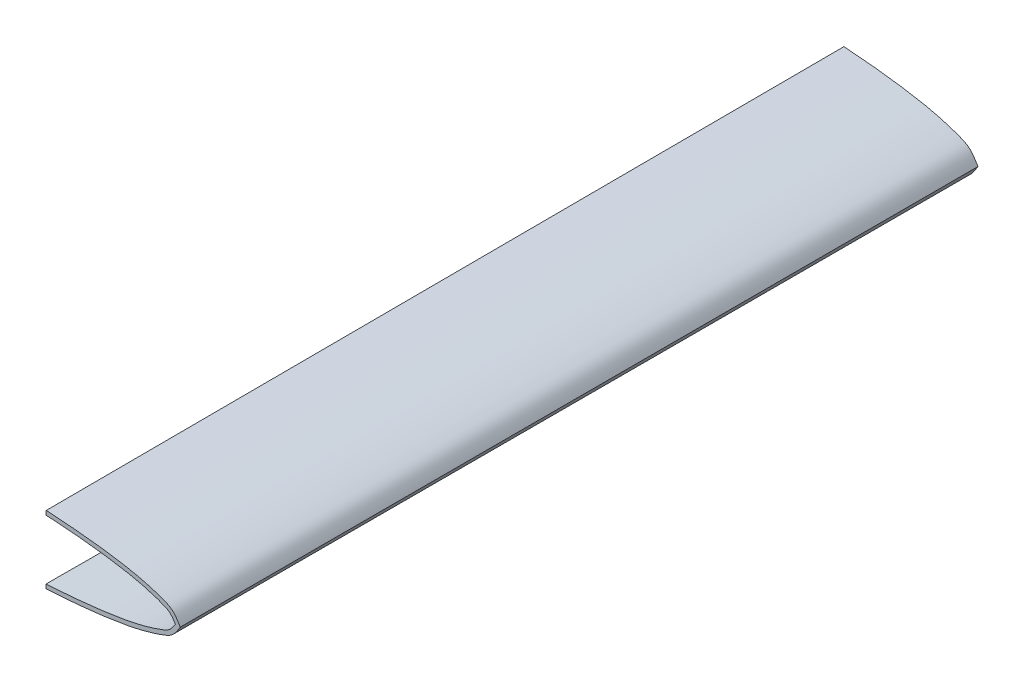
ISO-10303-21;
HEADER;
FILE_DESCRIPTION(('STEP AP214'),'2;1');
FILE_NAME('part.step','',(''),(''),'','','');
FILE_SCHEMA(('AUTOMOTIVE_DESIGN { 1 0 10303 214 1 1 1 1 }'));
ENDSEC;
DATA;
#1=APPLICATION_CONTEXT('core data for automotive mechanical design processes');
#2=APPLICATION_PROTOCOL_DEFINITION('international standard','automotive_design',2000,#1);
#3=PRODUCT_CONTEXT('',#1,'mechanical');
#4=PRODUCT('Part','Part','',(#3));
#5=PRODUCT_RELATED_PRODUCT_CATEGORY('part','',(#4));
#6=PRODUCT_DEFINITION_FORMATION('','',#4);
#7=PRODUCT_DEFINITION_CONTEXT('part definition',#1,'design');
#8=PRODUCT_DEFINITION('design','',#6,#7);
#9=PRODUCT_DEFINITION_SHAPE('','',#8);
#10=(LENGTH_UNIT() NAMED_UNIT(*) SI_UNIT(.MILLI.,.METRE.));
#11=(NAMED_UNIT(*) PLANE_ANGLE_UNIT() SI_UNIT($,.RADIAN.));
#12=(NAMED_UNIT(*) SI_UNIT($,.STERADIAN.) SOLID_ANGLE_UNIT());
#13=UNCERTAINTY_MEASURE_WITH_UNIT(LENGTH_MEASURE(1.E-05),#10,'distance_accuracy_value','');
#14=(GEOMETRIC_REPRESENTATION_CONTEXT(3) GLOBAL_UNCERTAINTY_ASSIGNED_CONTEXT((#13)) GLOBAL_UNIT_ASSIGNED_CONTEXT((#10,
#11,#12)) REPRESENTATION_CONTEXT('',''));
#15=CARTESIAN_POINT('',(0.,0.,0.));
#16=DIRECTION('',(0.,0.,1.));
#17=DIRECTION('',(1.,0.,0.));
#18=AXIS2_PLACEMENT_3D('',#15,#16,#17);
#19=CARTESIAN_POINT('',(100.769536267763,11.2606933813704,0.));
#20=DIRECTION('',(0.,0.,1.));
#21=DIRECTION('',(1.,0.,0.));
#22=AXIS2_PLACEMENT_3D('',#19,#20,#21);
#23=PLANE('',#22);
#24=CARTESIAN_POINT('',(75.1528156983858,13.7911850152499,0.));
#25=CARTESIAN_POINT('',(80.7851976616999,13.4672984762672,0.));
#26=CARTESIAN_POINT('',(89.6831000826608,12.780242775752,0.));
#27=CARTESIAN_POINT('',(100.19271352468,11.404332376345,0.));
#28=CARTESIAN_POINT('',(105.261986090452,10.5172214013167,0.));
#29=CARTESIAN_POINT('',(108.160349839012,9.94511209347713,0.));
#30=CARTESIAN_POINT('',(111.223864860041,9.29223477938955,0.));
#31=CARTESIAN_POINT('',(114.053942210508,8.49975371526067,0.));
#32=CARTESIAN_POINT('',(116.852382556985,7.59994673736133,0.));
#33=CARTESIAN_POINT('',(117.997565335274,7.21208080340003,0.));
#34=CARTESIAN_POINT('',(119.567638962217,6.62104689252843,0.));
#35=CARTESIAN_POINT('',(120.115223225885,6.40312349562739,0.));
#36=CARTESIAN_POINT('',(120.732213482138,6.1060537628292,0.));
#37=CARTESIAN_POINT('',(121.329957812074,5.78999102727578,0.));
#38=CARTESIAN_POINT('',(121.981529534301,5.31472994907229,0.));
#39=CARTESIAN_POINT('',(122.396077353504,4.9038056982637,0.));
#40=CARTESIAN_POINT('',(123.141325826217,4.11307873778657,0.));
#41=CARTESIAN_POINT('',(123.675270720084,3.30592812748182,0.));
#42=CARTESIAN_POINT('',(124.183013326308,2.48914366379694,0.));
#43=B_SPLINE_CURVE_WITH_KNOTS('',3,(#24,#25,#26,#27,#28,#29,#30,#31,#32,#33,#34,#35,#36,#37,#38,
#39,#40,#41,#42),.UNSPECIFIED.,.F.,.F.,(4,1,1,1,1,1,2,1,1,2,1,1,2,4),(0.,0.328632032767279,
0.519638641274434,0.617228047043696,0.628398988541279,0.691721568683053,0.799639628448459,
0.862947686180054,0.869998506981676,0.897219728739026,0.909961393733808,0.936717858711111,
0.943979047121781,1.),.UNSPECIFIED.);
#44=CARTESIAN_POINT('',(75.1528156983858,13.7911850152499,0.));
#45=VERTEX_POINT('',#44);
#46=CARTESIAN_POINT('',(124.183013326308,2.48914366379694,0.));
#47=VERTEX_POINT('',#46);
#48=EDGE_CURVE('E180',#45,#47,#43,.T.);
#49=ORIENTED_EDGE('',*,*,#48,.T.);
#50=CARTESIAN_POINT('',(124.183013326307,2.48914366380107,0.));
#51=CARTESIAN_POINT('',(123.762664602562,1.8129461097584,0.));
#52=CARTESIAN_POINT('',(123.183236107431,0.925651889228741,0.));
#53=CARTESIAN_POINT('',(122.20239770747,-0.134547293020064,0.));
#54=CARTESIAN_POINT('',(121.702491637412,-0.544366629772625,0.));
#55=CARTESIAN_POINT('',(121.144648740487,-0.902665023246407,0.));
#56=CARTESIAN_POINT('',(120.903562377172,-1.03863792482672,0.));
#57=CARTESIAN_POINT('',(120.086761633239,-1.44926248073076,0.));
#58=CARTESIAN_POINT('',(119.025617070715,-1.86175499994897,0.));
#59=CARTESIAN_POINT('',(117.401464731146,-2.43646341380278,0.));
#60=CARTESIAN_POINT('',(116.147628049391,-2.85616855876543,0.));
#61=CARTESIAN_POINT('',(113.273800058442,-3.76445255926568,0.));
#62=CARTESIAN_POINT('',(110.917927202203,-4.37422649396611,0.));
#63=CARTESIAN_POINT('',(108.303559495534,-4.93371503153042,0.));
#64=CARTESIAN_POINT('',(106.191863020433,-5.37135581455527,0.));
#65=CARTESIAN_POINT('',(102.9985062685,-5.94160858651463,0.));
#66=CARTESIAN_POINT('',(92.3104019337967,-7.58196898348306,0.));
#67=CARTESIAN_POINT('',(83.1925348058126,-8.35057877411217,0.));
#68=CARTESIAN_POINT('',(75.1528156964637,-8.81289768775202,0.));
#69=B_SPLINE_CURVE_WITH_KNOTS('',3,(#50,#51,#52,#53,#54,#55,#56,#57,#58,#59,#60,#61,#62,#63,#64,
#65,#66,#67,#68),.UNSPECIFIED.,.F.,.F.,(4,1,1,2,2,1,1,1,1,2,1,1,1,4),(0.,0.0463783338430015,
0.0614955759350706,0.0839865210975653,0.100157116178865,0.137375522409702,0.166388470634605,
0.200360026958327,0.214383355192011,0.341970581301063,0.370129953948071,0.467600424740325,
0.530904509390897,1.),.UNSPECIFIED.);
#70=CARTESIAN_POINT('',(75.1528156964637,-8.81289768775202,0.));
#71=VERTEX_POINT('',#70);
#72=EDGE_CURVE('E408',#47,#71,#69,.T.);
#73=ORIENTED_EDGE('',*,*,#72,.T.);
#74=DIRECTION('',(0.0574095202806261,-0.998350713417459,0.));
#75=VECTOR('',#74,1.);
#76=CARTESIAN_POINT('',(75.1528156964637,-8.81289768775202,0.));
#77=LINE('',#76,#75);
#78=CARTESIAN_POINT('',(75.2439533099092,-10.3977794453022,0.));
#79=VERTEX_POINT('',#78);
#80=EDGE_CURVE('E176',#71,#79,#77,.T.);
#81=ORIENTED_EDGE('',*,*,#80,.T.);
#82=CARTESIAN_POINT('',(75.2439533099092,-10.3977794453022,0.));
#83=CARTESIAN_POINT('',(79.6314739347866,-10.1454778734094,0.));
#84=CARTESIAN_POINT('',(86.2028643261661,-9.67226104029933,0.));
#85=CARTESIAN_POINT('',(94.9576944072849,-8.71902149074964,0.));
#86=CARTESIAN_POINT('',(100.412903888817,-7.96440929858423,0.));
#87=CARTESIAN_POINT('',(104.77112861132,-7.24282371970884,0.));
#88=CARTESIAN_POINT('',(108.031142816358,-6.62660170255856,0.));
#89=CARTESIAN_POINT('',(111.298552698541,-5.90965043605575,0.));
#90=CARTESIAN_POINT('',(113.998018017873,-5.18510607575265,0.));
#91=CARTESIAN_POINT('',(116.137848035604,-4.53037048440972,0.));
#92=CARTESIAN_POINT('',(117.727025687003,-4.0036391458447,0.));
#93=CARTESIAN_POINT('',(119.296822126561,-3.45060274071213,0.));
#94=CARTESIAN_POINT('',(120.646602005858,-2.94373425804329,0.));
#95=CARTESIAN_POINT('',(121.65560610611,-2.44186688112708,0.));
#96=CARTESIAN_POINT('',(122.211426609884,-2.11112173589993,0.));
#97=CARTESIAN_POINT('',(122.810602623774,-1.69712336719391,0.));
#98=CARTESIAN_POINT('',(123.447004056008,-1.13454364440382,0.));
#99=CARTESIAN_POINT('',(124.323991705955,-0.168137732178443,0.));
#100=CARTESIAN_POINT('',(125.021946505972,0.833969142449591,0.));
#101=CARTESIAN_POINT('',(125.623250298365,1.79859475272735,0.));
#102=CARTESIAN_POINT('',(125.907913756833,2.25696552530411,0.));
#103=CARTESIAN_POINT('',(126.052244040783,2.48914366566276,0.));
#104=B_SPLINE_CURVE_WITH_KNOTS('',3,(#82,#83,#84,#85,#86,#87,#88,#89,#90,#91,#92,#93,#94,#95,
#96,#97,#98,#99,#100,#101,#102,#103),.UNSPECIFIED.,.F.,.F.,(4,1,1,1,1,1,1,1,1,1,1,1,1,1,1,1,1,1,
1,4),(-0.0191611243996706,0.235629156700247,0.363024297250206,0.490419437800165,
0.554117008075144,0.617814578350124,0.681512148625103,0.745209718900082,0.777058504037572,
0.808907289175062,0.840756074312552,0.872604859450041,0.888529252018786,0.896491448303159,
0.904453644587531,0.920378037156276,0.936302429725021,0.96815121486251,0.984075607431255,1.),.UNSPECIFIED.);
#105=CARTESIAN_POINT('',(126.052244040783,2.48914366566275,0.));
#106=VERTEX_POINT('',#105);
#107=EDGE_CURVE('E374',#79,#106,#104,.T.);
#108=ORIENTED_EDGE('',*,*,#107,.T.);
#109=CARTESIAN_POINT('',(126.052244040783,2.48914366566275,0.));
#110=CARTESIAN_POINT('',(125.907914237619,2.7213210315682,0.));
#111=CARTESIAN_POINT('',(125.623329343008,3.17954124131456,0.));
#112=CARTESIAN_POINT('',(125.172003730789,3.90367868832122,0.));
#113=CARTESIAN_POINT('',(124.672362727551,4.64494280584374,0.));
#114=CARTESIAN_POINT('',(124.200683403558,5.2644072300795,0.));
#115=CARTESIAN_POINT('',(123.790132337263,5.74139578204919,0.));
#116=CARTESIAN_POINT('',(123.318223384305,6.23987483520747,0.));
#117=CARTESIAN_POINT('',(122.387769604836,7.02893356893599,0.));
#118=CARTESIAN_POINT('',(120.901809068775,7.82814225529177,0.));
#119=CARTESIAN_POINT('',(119.303820139159,8.41873514571322,0.));
#120=CARTESIAN_POINT('',(117.71984148179,8.98372016832412,0.));
#121=CARTESIAN_POINT('',(116.135475936236,9.50325785185327,0.));
#122=CARTESIAN_POINT('',(113.99722073468,10.1604169112802,0.));
#123=CARTESIAN_POINT('',(111.299067207461,10.8875342299337,0.));
#124=CARTESIAN_POINT('',(108.029470566984,11.6029026049814,0.));
#125=CARTESIAN_POINT('',(104.772495006038,12.2190261548502,0.));
#126=CARTESIAN_POINT('',(100.414534164485,12.9450182760341,0.));
#127=CARTESIAN_POINT('',(94.955134539592,13.6971303660071,0.));
#128=CARTESIAN_POINT('',(86.2021086206738,14.6449581358404,0.));
#129=CARTESIAN_POINT('',(79.6311175435253,15.1237856867148,0.));
#130=CARTESIAN_POINT('',(75.2439533148395,15.3760667726272,0.));
#131=B_SPLINE_CURVE_WITH_KNOTS('',3,(#109,#110,#111,#112,#113,#114,#115,#116,#117,#118,#119,
#120,#121,#122,#123,#124,#125,#126,#127,#128,#129,#130),.UNSPECIFIED.,.F.,.F.,(4,1,1,1,1,1,1,1,
1,1,1,1,1,1,1,1,1,1,1,4),(0.,0.015924393586159,0.0318487871723179,0.0477731807584768,
0.0636975743446357,0.0716597711377152,0.0796219679307947,0.0955463615169536,0.127395148689271,
0.159243935861589,0.191092723033907,0.222941510206225,0.254790297378543,0.318487871723179,
0.382185446067814,0.44588302041245,0.509580594757086,0.636975743446358,0.764370892135629,
1.01916118951417),.UNSPECIFIED.);
#132=CARTESIAN_POINT('',(75.2439533148395,15.3760667726272,0.));
#133=VERTEX_POINT('',#132);
#134=EDGE_CURVE('E96',#106,#133,#131,.T.);
#135=ORIENTED_EDGE('',*,*,#134,.T.);
#136=DIRECTION('',(-0.0574095221756194,-0.998350713308488,0.));
#137=VECTOR('',#136,1.);
#138=CARTESIAN_POINT('',(75.1528156983858,13.7911850152499,0.));
#139=LINE('',#138,#137);
#140=EDGE_CURVE('E12',#133,#45,#139,.T.);
#141=ORIENTED_EDGE('',*,*,#140,.T.);
#142=EDGE_LOOP('',(#49,#73,#81,#108,#135,#141));
#143=FACE_BOUND('',#142,.T.);
#144=ADVANCED_FACE('F86',(#143),#23,.T.);
#145=CARTESIAN_POINT('',(101.457562497655,-6.86051002621216,-302.26));
#146=DIRECTION('',(0.,0.,-1.));
#147=DIRECTION('',(-1.,0.,0.));
#148=AXIS2_PLACEMENT_3D('',#145,#146,#147);
#149=PLANE('',#148);
#150=CARTESIAN_POINT('',(75.1316259615264,-9.88184752246529,-302.26));
#151=CARTESIAN_POINT('',(79.5448421092211,-9.56891006006857,-302.26));
#152=CARTESIAN_POINT('',(86.1650874853238,-8.99378302431826,-302.26));
#153=CARTESIAN_POINT('',(94.9309929915524,-7.90990772043818,-302.26));
#154=CARTESIAN_POINT('',(101.460071685791,-6.89708568977216,-302.26));
#155=CARTESIAN_POINT('',(107.974095251212,-5.66480967774613,-302.26));
#156=CARTESIAN_POINT('',(113.175911311652,-4.27449493849512,-302.26));
#157=CARTESIAN_POINT('',(117.326109127603,-2.86335600249229,-302.26));
#158=CARTESIAN_POINT('',(119.937397078072,-1.90723948621917,-302.26));
#159=CARTESIAN_POINT('',(121.437099628345,-0.988706183758176,-302.26));
#160=CARTESIAN_POINT('',(122.39614743218,-0.0700928035577628,-302.26));
#161=CARTESIAN_POINT('',(123.303275897599,1.09792413091233,-302.26));
#162=CARTESIAN_POINT('',(123.900624756704,2.031351196659,-302.26));
#163=CARTESIAN_POINT('',(124.183820893465,2.48914366380016,-302.26));
#164=B_SPLINE_CURVE_WITH_KNOTS('',3,(#150,#151,#152,#153,#154,#155,#156,#157,#158,#159,#160,
#161,#162,#163),.UNSPECIFIED.,.F.,.F.,(4,1,1,1,1,1,1,1,1,1,1,4),(0.00306732926078913,
0.0463098158609226,0.0679310591609893,0.0895523024610561,0.111173545761123,0.13279478906119,
0.143605410711223,0.154416032361256,0.159821343186273,0.16522665401129,0.170631964836306,
0.176037275661323),.UNSPECIFIED.);
#165=CARTESIAN_POINT('',(75.1316259615264,-9.88184752246529,-302.26));
#166=VERTEX_POINT('',#165);
#167=CARTESIAN_POINT('',(124.183820893465,2.48914366379809,-302.26));
#168=VERTEX_POINT('',#167);
#169=EDGE_CURVE('E148',#166,#168,#164,.T.);
#170=ORIENTED_EDGE('',*,*,#169,.T.);
#171=CARTESIAN_POINT('',(124.183820893465,2.48914366379809,-302.26));
#172=CARTESIAN_POINT('',(123.9006247567,2.9469361309473,-302.26));
#173=CARTESIAN_POINT('',(123.303275897583,3.88036319671072,-302.26));
#174=CARTESIAN_POINT('',(122.396147432146,5.04838013119666,-302.26));
#175=CARTESIAN_POINT('',(121.437099628293,5.96699351139944,-302.26));
#176=CARTESIAN_POINT('',(119.937397077965,6.88552681386679,-302.26));
#177=CARTESIAN_POINT('',(117.326109127426,7.84164333015228,-302.26));
#178=CARTESIAN_POINT('',(113.17591131141,9.25278226616995,-302.26));
#179=CARTESIAN_POINT('',(107.974095250861,10.6430970054234,-302.26));
#180=CARTESIAN_POINT('',(101.460071685314,11.8753730174534,-302.26));
#181=CARTESIAN_POINT('',(94.9309929909544,12.8881950481205,-302.26));
#182=CARTESIAN_POINT('',(86.1650874845602,13.9720703519961,-302.26));
#183=CARTESIAN_POINT('',(79.544842108335,14.5471973877406,-302.26));
#184=CARTESIAN_POINT('',(75.1316259605585,14.8601348501323,-302.26));
#185=B_SPLINE_CURVE_WITH_KNOTS('',3,(#171,#172,#173,#174,#175,#176,#177,#178,#179,#180,#181,
#182,#183,#184),.UNSPECIFIED.,.F.,.F.,(4,1,1,1,1,1,1,1,1,1,1,4),(0.823962724335518,
0.829368035160634,0.834773345985749,0.840178656810864,0.84558396763598,0.856394589286211,
0.867205210936441,0.888826454236903,0.910447697537365,0.932068940837826,0.953690184138288,
0.996932670739211),.UNSPECIFIED.);
#186=CARTESIAN_POINT('',(75.1316259605585,14.8601348501323,-302.26));
#187=VERTEX_POINT('',#186);
#188=EDGE_CURVE('E170',#168,#187,#185,.T.);
#189=ORIENTED_EDGE('',*,*,#188,.T.);
#190=DIRECTION('',(0.0707315627734238,0.997495386469346,0.));
#191=VECTOR('',#190,1.);
#192=CARTESIAN_POINT('',(75.1316259605585,14.8601348501323,-302.26));
#193=LINE('',#192,#191);
#194=CARTESIAN_POINT('',(75.2439123164613,16.4436587761523,-302.26));
#195=VERTEX_POINT('',#194);
#196=EDGE_CURVE('E280',#187,#195,#193,.T.);
#197=ORIENTED_EDGE('',*,*,#196,.T.);
#198=CARTESIAN_POINT('',(75.2439123164613,16.4436587761523,-302.26));
#199=CARTESIAN_POINT('',(79.7625419739108,16.1232465300396,-302.26));
#200=CARTESIAN_POINT('',(86.5339558958297,15.5334514795596,-302.26));
#201=CARTESIAN_POINT('',(95.5262925015191,14.4093137531551,-302.26));
#202=CARTESIAN_POINT('',(101.108663961878,13.5323104151303,-302.26));
#203=CARTESIAN_POINT('',(105.579031134758,12.7097739770731,-302.26));
#204=CARTESIAN_POINT('',(108.907052927744,11.9957740442527,-302.26));
#205=CARTESIAN_POINT('',(112.172753651212,11.1634116794358,-302.26));
#206=CARTESIAN_POINT('',(115.421639165278,10.1744259240106,-302.26));
#207=CARTESIAN_POINT('',(118.096968320874,9.25933655116366,-302.26));
#208=CARTESIAN_POINT('',(120.274220651131,8.42398455323779,-302.26));
#209=CARTESIAN_POINT('',(121.775234627838,7.67641024144497,-302.26));
#210=CARTESIAN_POINT('',(123.1059302608,6.62657548183162,-302.26));
#211=CARTESIAN_POINT('',(124.182951922715,5.37559848586854,-302.26));
#212=CARTESIAN_POINT('',(125.017607765058,4.15600079238311,-302.26));
#213=CARTESIAN_POINT('',(125.62223368078,3.18205482269257,-302.26));
#214=CARTESIAN_POINT('',(125.906233132601,2.72238970575602,-302.26));
#215=CARTESIAN_POINT('',(126.050522046766,2.48914366379916,-302.26));
#216=B_SPLINE_CURVE_WITH_KNOTS('',3,(#198,#199,#200,#201,#202,#203,#204,#205,#206,#207,#208,
#209,#210,#211,#212,#213,#214,#215),.UNSPECIFIED.,.F.,.F.,(4,1,1,1,1,1,1,1,1,1,1,1,1,1,1,4),
(0.820675705973547,0.864739947164963,0.886772067760671,0.908804188356379,0.919820248654233,
0.930836308952087,0.941852369249941,0.952868429547795,0.963884489845649,0.969392519994576,
0.974900550143503,0.98040858029243,0.985916610441357,0.991424640590284,0.994178655664748,
0.996932670739211),.UNSPECIFIED.);
#217=CARTESIAN_POINT('',(126.050522046766,2.48914366379916,-302.26));
#218=VERTEX_POINT('',#217);
#219=EDGE_CURVE('E305',#195,#218,#216,.T.);
#220=ORIENTED_EDGE('',*,*,#219,.T.);
#221=CARTESIAN_POINT('',(126.050522046766,2.48914366379915,-302.26));
#222=CARTESIAN_POINT('',(125.906233132603,2.25589762184631,-302.26));
#223=CARTESIAN_POINT('',(125.622233680787,1.79623250491741,-302.26));
#224=CARTESIAN_POINT('',(125.017607765077,0.822286535245366,-302.26));
#225=CARTESIAN_POINT('',(124.182951922753,-0.397311158219951,-302.26));
#226=CARTESIAN_POINT('',(123.105930260859,-1.64828815417068,-302.26));
#227=CARTESIAN_POINT('',(121.775234627941,-2.69812291378157,-302.26));
#228=CARTESIAN_POINT('',(120.274220651269,-3.4456972255795,-302.26));
#229=CARTESIAN_POINT('',(118.096968321061,-4.28104922349885,-302.26));
#230=CARTESIAN_POINT('',(115.421639165508,-5.19613859633643,-302.26));
#231=CARTESIAN_POINT('',(112.172753651502,-6.18512435175533,-302.26));
#232=CARTESIAN_POINT('',(108.907052928099,-7.0174867165716,-302.26));
#233=CARTESIAN_POINT('',(105.579031135176,-7.73148664939128,-302.26));
#234=CARTESIAN_POINT('',(101.108663962379,-8.55402308744692,-302.26));
#235=CARTESIAN_POINT('',(95.5262925021211,-9.43102642547119,-302.26));
#236=CARTESIAN_POINT('',(86.5339558965972,-10.5551641518807,-302.26));
#237=CARTESIAN_POINT('',(79.7625419748007,-11.1449592023671,-302.26));
#238=CARTESIAN_POINT('',(75.2439123174331,-11.4653714484851,-302.26));
#239=B_SPLINE_CURVE_WITH_KNOTS('',3,(#221,#222,#223,#224,#225,#226,#227,#228,#229,#230,#231,
#232,#233,#234,#235,#236,#237,#238),.UNSPECIFIED.,.F.,.F.,(4,1,1,1,1,1,1,1,1,1,1,1,1,1,1,4),
(0.00306732926078913,0.00582134433520324,0.00857535940961733,0.0140833895584456,
0.0195914197072738,0.025099449856102,0.0306074800049302,0.0361155101537584,0.0471315704514148,
0.0581476307490713,0.0691636910467277,0.0801797513443841,0.0911958116420406,0.113227932237353,
0.135260052832666,0.179324294023292),.UNSPECIFIED.);
#240=CARTESIAN_POINT('',(75.2439123174331,-11.4653714484851,-302.26));
#241=VERTEX_POINT('',#240);
#242=EDGE_CURVE('E151',#218,#241,#239,.T.);
#243=ORIENTED_EDGE('',*,*,#242,.T.);
#244=DIRECTION('',(-0.0707315627758541,0.997495386469173,0.));
#245=VECTOR('',#244,1.);
#246=CARTESIAN_POINT('',(75.1316259615264,-9.88184752246529,-302.26));
#247=LINE('',#246,#245);
#248=EDGE_CURVE('E143',#241,#166,#247,.T.);
#249=ORIENTED_EDGE('',*,*,#248,.T.);
#250=EDGE_LOOP('',(#170,#189,#197,#220,#243,#249));
#251=FACE_BOUND('',#250,.T.);
#252=ADVANCED_FACE('F146',(#251),#149,.T.);
#253=CARTESIAN_POINT('',(126.050522046766,2.48914366379916,-302.26));
#254=CARTESIAN_POINT('',(126.052244040783,2.48914366566275,0.));
#255=CARTESIAN_POINT('',(125.901604446173,2.72987207399639,-302.26));
#256=CARTESIAN_POINT('',(125.907914237619,2.7213210315682,0.));
#257=CARTESIAN_POINT('',(125.604902270924,3.21263825532022,-302.26));
#258=CARTESIAN_POINT('',(125.623329343008,3.17954124131456,0.));
#259=CARTESIAN_POINT('',(125.153047004499,3.93274592075633,-302.260000000001));
#260=CARTESIAN_POINT('',(125.172003730789,3.90367868832122,0.));
#261=CARTESIAN_POINT('',(124.684188653158,4.64084229030509,-302.260000000001));
#262=CARTESIAN_POINT('',(124.672362727551,4.64494280584374,0.));
#263=CARTESIAN_POINT('',(124.270803221806,5.21427177724148,-302.260000000001));
#264=CARTESIAN_POINT('',(124.200683403558,5.2644072300795,0.));
#265=CARTESIAN_POINT('',(123.964505405958,5.60416092312338,-302.26));
#266=CARTESIAN_POINT('',(123.840789450331,5.6825410743337,0.));
#267=CARTESIAN_POINT('',(123.828893825587,5.76864619407927,-302.26));
#268=CARTESIAN_POINT('',(123.668765450952,5.86827691877787,0.));
#269=CARTESIAN_POINT('',(123.737921586138,5.87711721861143,-302.26));
#270=CARTESIAN_POINT('',(123.551378793268,5.99122515446146,0.));
#271=CARTESIAN_POINT('',(123.50804800718,6.14508431176297,-302.259999999999));
#272=CARTESIAN_POINT('',(123.250905368545,6.29696296730423,0.));
#273=CARTESIAN_POINT('',(122.870252171616,6.80872126063062,-302.259999999999));
#274=CARTESIAN_POINT('',(122.387769604836,7.02893356893599,0.));
#275=CARTESIAN_POINT('',(122.015978980211,7.48022527728928,-302.259999999999));
#276=CARTESIAN_POINT('',(121.251385128752,7.64012634444086,0.));
#277=CARTESIAN_POINT('',(121.324369333532,7.88127969871652,-302.26));
#278=CARTESIAN_POINT('',(120.47370947687,7.96906518135842,0.));
#279=CARTESIAN_POINT('',(120.82289426594,8.14418429774705,-302.26));
#280=CARTESIAN_POINT('',(119.930767961781,8.18644696897885,0.));
#281=CARTESIAN_POINT('',(120.047217245069,8.50969513973765,-302.260000000001));
#282=CARTESIAN_POINT('',(119.124835114461,8.48218202527402,0.));
#283=CARTESIAN_POINT('',(119.206958721215,8.83279082969316,-302.26));
#284=CARTESIAN_POINT('',(118.286044628359,8.78176271386075,0.));
#285=CARTESIAN_POINT('',(118.144859496477,9.2282268323333,-302.259999999999));
#286=CARTESIAN_POINT('',(117.229939226941,9.14436660711733,0.));
#287=CARTESIAN_POINT('',(117.039981158221,9.62524853756014,-302.259999999999));
#288=CARTESIAN_POINT('',(116.135475936236,9.50325785185327,0.));
#289=CARTESIAN_POINT('',(114.892517577467,10.3458641446983,-302.259999999999));
#290=CARTESIAN_POINT('',(113.99722073468,10.1604169112802,0.));
#291=CARTESIAN_POINT('',(112.181757458638,11.1611369974262,-302.26));
#292=CARTESIAN_POINT('',(111.299067207461,10.8875342299337,0.));
#293=CARTESIAN_POINT('',(109.517094355044,11.8430967681716,-302.260000000001));
#294=CARTESIAN_POINT('',(108.651362525735,11.4668363286464,0.));
#295=CARTESIAN_POINT('',(107.938052568344,12.1981742426355,-302.26));
#296=CARTESIAN_POINT('',(107.097821175233,11.7738870267384,0.));
#297=CARTESIAN_POINT('',(106.831137923282,12.4369023732548,-302.26));
#298=CARTESIAN_POINT('',(106.011124521868,11.9824461374782,0.));
#299=CARTESIAN_POINT('',(105.164149712004,12.7825639793631,-302.26));
#300=CARTESIAN_POINT('',(104.377544055979,12.2835299300148,0.));
#301=CARTESIAN_POINT('',(103.490694611183,13.0952804391596,-302.260000000001));
#302=CARTESIAN_POINT('',(102.739632501743,12.5576253258528,0.));
#303=CARTESIAN_POINT('',(102.37543452666,13.291048357514,-302.26));
#304=CARTESIAN_POINT('',(101.649457592704,12.730161249195,0.));
#305=CARTESIAN_POINT('',(100.069907103265,13.6943518942846,-302.26));
#306=CARTESIAN_POINT('',(99.3958777645713,13.0853530832554,0.));
#307=CARTESIAN_POINT('',(95.5206572672535,14.4057129790159,-302.259999999999));
#308=CARTESIAN_POINT('',(94.955134539592,13.6971303660071,0.));
#309=CARTESIAN_POINT('',(86.5334830132798,15.5342388875208,-302.259999999999));
#310=CARTESIAN_POINT('',(86.2021086206738,14.6449581358404,0.));
#311=CARTESIAN_POINT('',(79.76166804019,16.1233084999481,-302.26));
#312=CARTESIAN_POINT('',(79.6311175435253,15.1237856867148,0.));
#313=CARTESIAN_POINT('',(75.2439123164613,16.4436587761523,-302.26));
#314=CARTESIAN_POINT('',(75.2439533148395,15.3760667726272,0.));
#315=B_SPLINE_SURFACE_WITH_KNOTS('',3,1,((#253,#254),(#255,#256),(#257,#258),(#259,#260),(#261,
#262),(#263,#264),(#265,#266),(#267,#268),(#269,#270),(#271,#272),(#273,#274),(#275,#276),(#277,
#278),(#279,#280),(#281,#282),(#283,#284),(#285,#286),(#287,#288),(#289,#290),(#291,#292),(#293,
#294),(#295,#296),(#297,#298),(#299,#300),(#301,#302),(#303,#304),(#305,#306),(#307,#308),(#309,
#310),(#311,#312),(#313,#314)),.UNSPECIFIED.,.F.,.F.,.F.,(4,1,1,1,1,1,2,1,1,1,2,1,1,1,1,1,1,1,2,
1,2,1,1,1,4),(2,2),(0.,0.0156250000000001,0.03125,0.046875,0.0625,0.0703124999999999,
0.0742691220999658,0.078125,0.09375,0.125,0.137870891656965,0.15625,0.185238472086489,0.1875,
0.21875,0.25,0.3125,0.375,0.401836658283072,0.4375,0.495808632238874,0.5,0.625,0.75,1.),(0.,1.),.UNSPECIFIED.);
#316=DIRECTION('',(1.35638597486057E-07,-0.0035320100057855,0.999993762433197));
#317=VECTOR('',#316,1.);
#318=CARTESIAN_POINT('',(75.2439328156505,15.9098627743898,-151.13));
#319=LINE('',#318,#317);
#320=EDGE_CURVE('E111',#195,#133,#319,.T.);
#321=DIRECTION('',(-5.69706218585269E-06,-6.16553557180664E-12,-0.999999999983772));
#322=VECTOR('',#321,1.);
#323=CARTESIAN_POINT('',(126.051383043774,2.48914366473096,-151.13));
#324=LINE('',#323,#322);
#325=EDGE_CURVE('E157',#106,#218,#324,.T.);
#326=ORIENTED_EDGE('',*,*,#219,.F.);
#327=ORIENTED_EDGE('',*,*,#320,.T.);
#328=ORIENTED_EDGE('',*,*,#134,.F.);
#329=ORIENTED_EDGE('',*,*,#325,.T.);
#330=EDGE_LOOP('',(#326,#327,#328,#329));
#331=FACE_BOUND('',#330,.T.);
#332=ADVANCED_FACE('F245',(#331),#315,.T.);
#333=CARTESIAN_POINT('',(75.2439123164613,16.4436587761523,-302.26));
#334=CARTESIAN_POINT('',(75.2439533148395,15.3760667726272,0.));
#335=CARTESIAN_POINT('',(75.2251979238109,16.1797381218157,-302.26));
#336=CARTESIAN_POINT('',(75.2287637120972,15.1119198130643,0.));
#337=CARTESIAN_POINT('',(75.2064835311604,15.915817467479,-302.26));
#338=CARTESIAN_POINT('',(75.213574109355,14.8477728535014,0.));
#339=CARTESIAN_POINT('',(75.1690547458595,15.3879761588056,-302.26));
#340=CARTESIAN_POINT('',(75.1831949038703,14.3194789343757,0.));
#341=CARTESIAN_POINT('',(75.150340353209,15.1240555044689,-302.26));
#342=CARTESIAN_POINT('',(75.168005301128,14.0553319748128,0.));
#343=CARTESIAN_POINT('',(75.1316259605585,14.8601348501323,-302.26));
#344=CARTESIAN_POINT('',(75.1528156983858,13.7911850152499,0.));
#345=B_SPLINE_SURFACE_WITH_KNOTS('',3,1,((#333,#334),(#335,#336),(#337,#338),(#339,#340),(#341,
#342),(#343,#344)),.UNSPECIFIED.,.F.,.F.,.F.,(4,2,4),(2,2),(0.,0.5,1.),(0.,1.),.UNSPECIFIED.);
#346=DIRECTION('',(7.01039014964792E-05,-0.00353650217573718,0.999993744099334));
#347=VECTOR('',#346,1.);
#348=CARTESIAN_POINT('',(75.1422208294721,14.3256599326911,-151.13));
#349=LINE('',#348,#347);
#350=EDGE_CURVE('E182',#187,#45,#349,.T.);
#351=ORIENTED_EDGE('',*,*,#196,.F.);
#352=ORIENTED_EDGE('',*,*,#350,.T.);
#353=ORIENTED_EDGE('',*,*,#140,.F.);
#354=ORIENTED_EDGE('',*,*,#320,.F.);
#355=EDGE_LOOP('',(#351,#352,#353,#354));
#356=FACE_BOUND('',#355,.T.);
#357=ADVANCED_FACE('F214',(#356),#345,.T.);
#358=CARTESIAN_POINT('',(75.2439123174331,-11.4653714484851,-302.26));
#359=CARTESIAN_POINT('',(75.2439533099092,-10.3977794453022,0.));
#360=CARTESIAN_POINT('',(79.7616400682513,-11.1450231558054,-302.26));
#361=CARTESIAN_POINT('',(79.6314739347866,-10.1454778734094,0.));
#362=CARTESIAN_POINT('',(86.5348846677885,-10.5604297720368,-302.26));
#363=CARTESIAN_POINT('',(86.2028643261661,-9.67226104029933,0.));
#364=CARTESIAN_POINT('',(95.5226249244183,-9.4334613173945,-302.26));
#365=CARTESIAN_POINT('',(94.9576944072849,-8.71902149074964,0.));
#366=CARTESIAN_POINT('',(100.743735656179,-8.61347641992925,-302.26));
#367=CARTESIAN_POINT('',(100.051361046166,-8.01442106036506,0.));
#368=CARTESIAN_POINT('',(103.716325382929,-8.07252982191887,-302.26));
#369=CARTESIAN_POINT('',(102.95941701879,-7.54169860743148,0.));
#370=CARTESIAN_POINT('',(104.829031193043,-7.862717191425,-302.26));
#371=CARTESIAN_POINT('',(104.04838274509,-7.35679033818157,0.));
#372=CARTESIAN_POINT('',(105.943021461127,-7.64747910198618,-302.26));
#373=CARTESIAN_POINT('',(105.139137233686,-7.16765744969443,0.));
#374=CARTESIAN_POINT('',(107.418564375856,-7.33844113705056,-302.26));
#375=CARTESIAN_POINT('',(106.58653575197,-6.89966759221972,0.));
#376=CARTESIAN_POINT('',(109.625328580131,-6.83079331577127,-302.26));
#377=CARTESIAN_POINT('',(108.76153176722,-6.46633613985228,0.));
#378=CARTESIAN_POINT('',(112.179488861818,-6.17237157150492,-302.26));
#379=CARTESIAN_POINT('',(111.298552698541,-5.90965043605575,0.));
#380=CARTESIAN_POINT('',(114.890611203908,-5.35748510435158,-302.26));
#381=CARTESIAN_POINT('',(113.998018017873,-5.18510607575265,0.));
#382=CARTESIAN_POINT('',(117.038915457999,-4.64075954290229,-302.26));
#383=CARTESIAN_POINT('',(116.137848035604,-4.53037048440972,0.));
#384=CARTESIAN_POINT('',(118.126230446452,-4.25353020239575,-302.26));
#385=CARTESIAN_POINT('',(117.217605962166,-4.17248580267942,0.));
#386=CARTESIAN_POINT('',(119.189096304885,-3.86238837808011,-302.26));
#387=CARTESIAN_POINT('',(118.270349676999,-3.81222710115048,0.));
#388=CARTESIAN_POINT('',(119.81937165439,-3.62318063204751,-302.26));
#389=CARTESIAN_POINT('',(118.893580989507,-3.59237782003555,0.));
#390=CARTESIAN_POINT('',(120.83168110926,-3.16619370612415,-302.26));
#391=CARTESIAN_POINT('',(119.939488229895,-3.20926917391654,0.));
#392=CARTESIAN_POINT('',(121.557411326469,-2.78318330961843,-302.26));
#393=CARTESIAN_POINT('',(120.726070680966,-2.90101475699771,0.));
#394=CARTESIAN_POINT('',(122.168793704848,-2.36472554854283,-302.26));
#395=CARTESIAN_POINT('',(121.479420943648,-2.52949941434917,0.));
#396=CARTESIAN_POINT('',(122.505211883044,-2.10655140163551,-302.26));
#397=CARTESIAN_POINT('',(121.902627952053,-2.29487468534431,0.));
#398=CARTESIAN_POINT('',(122.748205629028,-1.90707901970757,-302.26));
#399=CARTESIAN_POINT('',(122.211426609884,-2.11112173589993,0.));
#400=CARTESIAN_POINT('',(123.081844694078,-1.60359250117263,-302.259999999999));
#401=CARTESIAN_POINT('',(122.68864062304,-1.78139254382554,0.));
#402=CARTESIAN_POINT('',(123.380747880298,-1.30158385738115,-302.259999999999));
#403=CARTESIAN_POINT('',(123.088812109166,-1.45118580759383,0.));
#404=CARTESIAN_POINT('',(123.760444806884,-0.881745945016476,-302.259999999999));
#405=CARTESIAN_POINT('',(123.576995753059,-0.991297904764645,0.));
#406=CARTESIAN_POINT('',(124.066517639369,-0.502345989339037,-302.26));
#407=CARTESIAN_POINT('',(123.954320281267,-0.57550110886945,0.));
#408=CARTESIAN_POINT('',(124.575049752634,0.177932407930226,-302.26));
#409=CARTESIAN_POINT('',(124.553253041162,0.161030231266028,0.));
#410=CARTESIAN_POINT('',(125.049638173333,0.881950711382732,-302.26));
#411=CARTESIAN_POINT('',(125.069134365796,0.909669011063171,0.));
#412=CARTESIAN_POINT('',(125.604873981201,1.76595055577265,-302.26));
#413=CARTESIAN_POINT('',(125.623250298365,1.79859475272735,0.));
#414=CARTESIAN_POINT('',(125.901604458875,2.24841527413586,-302.26));
#415=CARTESIAN_POINT('',(125.907913756833,2.25696552530411,0.));
#416=CARTESIAN_POINT('',(126.050522046766,2.48914366379915,-302.26));
#417=CARTESIAN_POINT('',(126.052244040783,2.48914366566276,0.));
#418=B_SPLINE_SURFACE_WITH_KNOTS('',3,1,((#358,#359),(#360,#361),(#362,#363),(#364,#365),(#366,
#367),(#368,#369),(#370,#371),(#372,#373),(#374,#375),(#376,#377),(#378,#379),(#380,#381),(#382,
#383),(#384,#385),(#386,#387),(#388,#389),(#390,#391),(#392,#393),(#394,#395),(#396,#397),(#398,
#399),(#400,#401),(#402,#403),(#404,#405),(#406,#407),(#408,#409),(#410,#411),(#412,#413),(#414,
#415),(#416,#417)),.UNSPECIFIED.,.F.,.F.,.F.,(4,1,1,1,2,1,1,1,1,1,1,1,1,1,1,1,1,1,1,1,1,1,1,1,1,
1,4),(2,2),(0.,0.25,0.375,0.5,0.541789129278894,0.5625,0.60441329928742,0.625,0.6875,0.75,
0.78125,0.8125,0.813697916671564,0.84375,0.849697390547212,0.875,0.888888355383287,0.890625,
0.8984375,0.90625,0.915514076941368,0.921875,0.9375,0.942404744118277,0.96875,0.984375,1.),(0.,
1.),.UNSPECIFIED.);
#419=DIRECTION('',(1.35619071047098E-07,0.00353201000465305,0.999993762433201));
#420=VECTOR('',#419,1.);
#421=CARTESIAN_POINT('',(75.2439328136711,-10.9315754468937,-151.13));
#422=LINE('',#421,#420);
#423=EDGE_CURVE('E178',#241,#79,#422,.T.);
#424=ORIENTED_EDGE('',*,*,#242,.F.);
#425=ORIENTED_EDGE('',*,*,#325,.F.);
#426=ORIENTED_EDGE('',*,*,#107,.F.);
#427=ORIENTED_EDGE('',*,*,#423,.F.);
#428=EDGE_LOOP('',(#424,#425,#426,#427));
#429=FACE_BOUND('',#428,.T.);
#430=ADVANCED_FACE('F201',(#429),#418,.T.);
#431=CARTESIAN_POINT('',(75.1316259605585,14.8601348501323,-302.26));
#432=CARTESIAN_POINT('',(75.1528156983858,13.7911850152499,0.));
#433=CARTESIAN_POINT('',(80.7988987859636,14.4582732785985,-302.26));
#434=CARTESIAN_POINT('',(80.7851976616999,13.4672984762672,0.));
#435=CARTESIAN_POINT('',(89.7537297641589,13.6478975704,-302.26));
#436=CARTESIAN_POINT('',(89.6831000826608,12.780242775752,0.));
#437=CARTESIAN_POINT('',(98.8580438452595,12.3005845982088,-302.26));
#438=CARTESIAN_POINT('',(98.7483293110992,11.5934300316649,0.));
#439=CARTESIAN_POINT('',(103.77079099719,11.4314866171897,-302.26));
#440=CARTESIAN_POINT('',(103.638567689237,10.8013158669614,0.));
#441=CARTESIAN_POINT('',(105.618077808876,11.0785648349989,-302.26));
#442=CARTESIAN_POINT('',(105.476916351211,10.4747962216692,0.));
#443=CARTESIAN_POINT('',(107.263880358014,10.7173319146387,-302.26));
#444=CARTESIAN_POINT('',(107.118595065966,10.1507445308972,0.));
#445=CARTESIAN_POINT('',(108.520654344425,10.436430685457,-302.26));
#446=CARTESIAN_POINT('',(108.372666148968,9.89986455878922,0.));
#447=CARTESIAN_POINT('',(111.397318731707,9.73473245018553,-302.26));
#448=CARTESIAN_POINT('',(111.248176884008,9.28542690234623,0.));
#449=CARTESIAN_POINT('',(114.210210036073,8.89130814029017,-302.26));
#450=CARTESIAN_POINT('',(114.053942210508,8.49975371526067,0.));
#451=CARTESIAN_POINT('',(115.978065170715,8.29619557506967,-302.26));
#452=CARTESIAN_POINT('',(115.817710619782,7.93263384648767,0.));
#453=CARTESIAN_POINT('',(116.534572632361,8.10885856228903,-302.26));
#454=CARTESIAN_POINT('',(116.372931618966,7.75410873536412,0.));
#455=CARTESIAN_POINT('',(117.567911440975,7.74885872950409,-302.26));
#456=CARTESIAN_POINT('',(117.40532525773,7.41266855187751,0.));
#457=CARTESIAN_POINT('',(118.715246368204,7.33501620981077,-302.26));
#458=CARTESIAN_POINT('',(118.544176637451,7.00631604809917,0.));
#459=CARTESIAN_POINT('',(119.730186276285,6.91270357874969,-302.26));
#460=CARTESIAN_POINT('',(119.567638962217,6.62104689252843,0.));
#461=CARTESIAN_POINT('',(120.26305593841,6.65570947430654,-302.26));
#462=CARTESIAN_POINT('',(120.115223225885,6.40312349562739,0.));
#463=CARTESIAN_POINT('',(120.710329291758,6.39818253496073,-302.26));
#464=CARTESIAN_POINT('',(120.575992985292,6.18127112774752,0.));
#465=CARTESIAN_POINT('',(120.749500233061,6.37526161999715,-302.26));
#466=CARTESIAN_POINT('',(120.616327056787,6.16146461979285,0.));
#467=CARTESIAN_POINT('',(120.93905106731,6.26248512951358,-302.26));
#468=CARTESIAN_POINT('',(120.811399575319,6.06369631769182,0.));
#469=CARTESIAN_POINT('',(121.471115921366,5.91089003640414,-302.26));
#470=CARTESIAN_POINT('',(121.366510390977,5.76332931457733,0.));
#471=CARTESIAN_POINT('',(121.968396205269,5.45922237491926,-302.26));
#472=CARTESIAN_POINT('',(121.905242930967,5.37037394361035,0.));
#473=CARTESIAN_POINT('',(122.369195190861,5.02921241187354,-302.26));
#474=CARTESIAN_POINT('',(122.329362197604,4.96993769603509,0.));
#475=CARTESIAN_POINT('',(122.452767896855,4.93574218321144,-302.26));
#476=CARTESIAN_POINT('',(122.417117019266,4.88148209537587,0.));
#477=CARTESIAN_POINT('',(123.148886943378,4.13432484038659,-302.26));
#478=CARTESIAN_POINT('',(123.141325826217,4.11307873778657,0.));
#479=CARTESIAN_POINT('',(123.674296740345,3.3128000942594,-302.26));
#480=CARTESIAN_POINT('',(123.675270720084,3.30592812748182,0.));
#481=CARTESIAN_POINT('',(124.183820893465,2.48914366379809,-302.26));
#482=CARTESIAN_POINT('',(124.183013326308,2.48914366379694,0.));
#483=B_SPLINE_SURFACE_WITH_KNOTS('',3,1,((#431,#432),(#433,#434),(#435,#436),(#437,#438),(#439,
#440),(#441,#442),(#443,#444),(#445,#446),(#447,#448),(#449,#450),(#451,#452),(#453,#454),(#455,
#456),(#457,#458),(#459,#460),(#461,#462),(#463,#464),(#465,#466),(#467,#468),(#469,#470),(#471,
#472),(#473,#474),(#475,#476),(#477,#478),(#479,#480),(#481,#482)),.UNSPECIFIED.,.F.,.F.,.F.,(4,
1,1,1,1,1,1,1,2,1,1,1,1,2,2,1,1,1,2,4),(2,2),(0.,0.328632032767279,0.519638641274434,
0.532399575259499,0.617228047043696,0.628398988541279,0.629870046051768,0.691721568683053,
0.799639628448459,0.799639973041407,0.833611529365129,0.862947686180054,0.869998506981676,
0.897219728739026,0.899842883821299,0.909961393733808,0.936717858711111,0.938504424065063,
0.943979047121781,1.),(0.,1.),.UNSPECIFIED.);
#484=DIRECTION('',(-2.67176324307227E-06,0.,0.999999999996431));
#485=VECTOR('',#484,1.);
#486=CARTESIAN_POINT('',(124.183417109886,2.48914366379752,-151.13));
#487=LINE('',#486,#485);
#488=EDGE_CURVE('E169',#168,#47,#487,.T.);
#489=ORIENTED_EDGE('',*,*,#188,.F.);
#490=ORIENTED_EDGE('',*,*,#488,.T.);
#491=ORIENTED_EDGE('',*,*,#48,.F.);
#492=ORIENTED_EDGE('',*,*,#350,.F.);
#493=EDGE_LOOP('',(#489,#490,#491,#492));
#494=FACE_BOUND('',#493,.T.);
#495=ADVANCED_FACE('F213',(#494),#483,.T.);
#496=CARTESIAN_POINT('',(124.183820893465,2.48914366380016,-302.26));
#497=CARTESIAN_POINT('',(124.183013326307,2.48914366380107,0.));
#498=CARTESIAN_POINT('',(123.762001598115,1.80726396687104,-302.26));
#499=CARTESIAN_POINT('',(123.762664602562,1.8129461097584,0.));
#500=CARTESIAN_POINT('',(123.188779572297,0.903605379510802,-302.26));
#501=CARTESIAN_POINT('',(123.183236107431,0.925651889228741,0.));
#502=CARTESIAN_POINT('',(122.483194601916,0.070169141858911,-302.26));
#503=CARTESIAN_POINT('',(122.444194254084,0.126813295025669,0.));
#504=CARTESIAN_POINT('',(122.039816898779,-0.404274833058764,-302.26));
#505=CARTESIAN_POINT('',(121.977704188153,-0.31874939532386,0.));
#506=CARTESIAN_POINT('',(121.755039100848,-0.670928416547468,-302.26));
#507=CARTESIAN_POINT('',(121.676713492353,-0.560923742917212,0.));
#508=CARTESIAN_POINT('',(121.257288908034,-1.06888351470099,-302.26));
#509=CARTESIAN_POINT('',(121.144648740487,-0.902665023246407,0.));
#510=CARTESIAN_POINT('',(121.028449231994,-1.22995843854618,-302.26));
#511=CARTESIAN_POINT('',(120.903562377172,-1.03863792482672,0.));
#512=CARTESIAN_POINT('',(120.749829145996,-1.39736045839746,-302.26));
#513=CARTESIAN_POINT('',(120.616035944057,-1.18318408836257,0.));
#514=CARTESIAN_POINT('',(120.710653877909,-1.42027739789395,-302.26));
#515=CARTESIAN_POINT('',(120.575770555582,-1.20308874982486,0.));
#516=CARTESIAN_POINT('',(120.155595007251,-1.73608640367689,-302.26));
#517=CARTESIAN_POINT('',(120.007663683026,-1.47946450916441,0.));
#518=CARTESIAN_POINT('',(119.609615741723,-1.98163515010285,-302.26));
#519=CARTESIAN_POINT('',(119.453334021561,-1.69466512171868,0.));
#520=CARTESIAN_POINT('',(118.591308585044,-2.39620944313001,-302.26));
#521=CARTESIAN_POINT('',(118.427596303641,-2.07336542473712,0.));
#522=CARTESIAN_POINT('',(117.565690566703,-2.77786272701373,-302.26));
#523=CARTESIAN_POINT('',(117.401464731146,-2.43646341380278,0.));
#524=CARTESIAN_POINT('',(116.533302755095,-3.12619923411679,-302.26));
#525=CARTESIAN_POINT('',(116.375949385561,-2.77974102965444,0.));
#526=CARTESIAN_POINT('',(115.977708453576,-3.31679695090191,-302.26));
#527=CARTESIAN_POINT('',(115.820765249702,-2.95822841476136,0.));
#528=CARTESIAN_POINT('',(115.748363587136,-3.39547417111661,-302.26));
#529=CARTESIAN_POINT('',(115.591589682553,-3.03190654790453,0.));
#530=CARTESIAN_POINT('',(113.428408493898,-4.17789993895762,-302.26));
#531=CARTESIAN_POINT('',(113.273794325697,-3.7644540430802,0.));
#532=CARTESIAN_POINT('',(111.06978702783,-4.84062932209757,-302.260000000001));
#533=CARTESIAN_POINT('',(110.917927202203,-4.37422649396611,0.));
#534=CARTESIAN_POINT('',(108.451828259485,-5.47081518126267,-302.26));
#535=CARTESIAN_POINT('',(108.303559495534,-4.93371503153042,0.));
#536=CARTESIAN_POINT('',(107.764613250494,-5.63019990941925,-302.26));
#537=CARTESIAN_POINT('',(107.617734293937,-5.07584960521751,0.));
#538=CARTESIAN_POINT('',(105.643297656302,-6.09662799708057,-302.26));
#539=CARTESIAN_POINT('',(105.502239208659,-5.49450519021948,0.));
#540=CARTESIAN_POINT('',(103.771571827667,-6.4559610250737,-302.259999999999));
#541=CARTESIAN_POINT('',(103.638531897048,-5.82362457650509,0.));
#542=CARTESIAN_POINT('',(101.249708372803,-6.90074011195367,-302.259999999999));
#543=CARTESIAN_POINT('',(101.128017645322,-6.22868245521549,0.));
#544=CARTESIAN_POINT('',(92.1732169152084,-8.4206680792156,-302.259999999997));
#545=CARTESIAN_POINT('',(92.0918583700681,-7.60039157293331,0.));
#546=CARTESIAN_POINT('',(83.2212494325298,-9.3082190945708,-302.26));
#547=CARTESIAN_POINT('',(83.1925348058126,-8.35057877411217,0.));
#548=CARTESIAN_POINT('',(75.1316259615264,-9.88184752246529,-302.26));
#549=CARTESIAN_POINT('',(75.1528156964637,-8.81289768775202,0.));
#550=B_SPLINE_SURFACE_WITH_KNOTS('',3,1,((#496,#497),(#498,#499),(#500,#501),(#502,#503),(#504,
#505),(#506,#507),(#508,#509),(#510,#511),(#512,#513),(#514,#515),(#516,#517),(#518,#519),(#520,
#521),(#522,#523),(#524,#525),(#526,#527),(#528,#529),(#530,#531),(#532,#533),(#534,#535),(#536,
#537),(#538,#539),(#540,#541),(#542,#543),(#544,#545),(#546,#547),(#548,#549)),.UNSPECIFIED.,
.F.,.F.,.F.,(4,1,1,1,2,2,2,1,1,1,1,2,1,2,1,1,1,1,1,4),(2,2),(0.,0.0463783338430015,
0.0614955759350706,0.0632821412890326,0.0839865210975653,0.100157116178865,0.102780271261117,
0.137052313819811,0.137375522409702,0.166388470634605,0.200360026958327,0.200360371551274,
0.214383355192011,0.341970581301063,0.370129953948071,0.382771952956137,0.467600424740325,
0.480361358725392,0.530904509390897,1.),(0.,1.),.UNSPECIFIED.);
#551=DIRECTION('',(7.01038919354385E-05,0.00353650217517795,0.999993744099337));
#552=VECTOR('',#551,1.);
#553=CARTESIAN_POINT('',(75.142220828995,-9.34737260510865,-151.13));
#554=LINE('',#553,#552);
#555=EDGE_CURVE('E166',#166,#71,#554,.T.);
#556=ORIENTED_EDGE('',*,*,#169,.F.);
#557=ORIENTED_EDGE('',*,*,#555,.T.);
#558=ORIENTED_EDGE('',*,*,#72,.F.);
#559=ORIENTED_EDGE('',*,*,#488,.F.);
#560=EDGE_LOOP('',(#556,#557,#558,#559));
#561=FACE_BOUND('',#560,.T.);
#562=ADVANCED_FACE('F165',(#561),#550,.T.);
#563=CARTESIAN_POINT('',(75.1316259615264,-9.88184752246529,-302.26));
#564=CARTESIAN_POINT('',(75.1528156964637,-8.81289768775202,0.));
#565=CARTESIAN_POINT('',(75.1503403541775,-10.1457681768019,-302.26));
#566=CARTESIAN_POINT('',(75.1680052987046,-9.07704464734372,0.));
#567=CARTESIAN_POINT('',(75.1690547468286,-10.4096888311386,-302.26));
#568=CARTESIAN_POINT('',(75.1831949009455,-9.34119160693542,0.));
#569=CARTESIAN_POINT('',(75.2064835321308,-10.9375301398118,-302.26));
#570=CARTESIAN_POINT('',(75.2135741054273,-9.86948552611882,0.));
#571=CARTESIAN_POINT('',(75.2251979247819,-11.2014507941485,-302.26));
#572=CARTESIAN_POINT('',(75.2287637076683,-10.1336324857105,0.));
#573=CARTESIAN_POINT('',(75.2439123174331,-11.4653714484851,-302.26));
#574=CARTESIAN_POINT('',(75.2439533099092,-10.3977794453022,0.));
#575=B_SPLINE_SURFACE_WITH_KNOTS('',3,1,((#563,#564),(#565,#566),(#567,#568),(#569,#570),(#571,
#572),(#573,#574)),.UNSPECIFIED.,.F.,.F.,.F.,(4,2,4),(2,2),(0.,0.5,1.),(0.,1.),.UNSPECIFIED.);
#576=ORIENTED_EDGE('',*,*,#248,.F.);
#577=ORIENTED_EDGE('',*,*,#423,.T.);
#578=ORIENTED_EDGE('',*,*,#80,.F.);
#579=ORIENTED_EDGE('',*,*,#555,.F.);
#580=EDGE_LOOP('',(#576,#577,#578,#579));
#581=FACE_BOUND('',#580,.T.);
#582=ADVANCED_FACE('F174',(#581),#575,.T.);
#583=CLOSED_SHELL('',(#144,#252,#332,#357,#430,#495,#562,#582));
#584=MANIFOLD_SOLID_BREP('B2',#583);
#585=ADVANCED_BREP_SHAPE_REPRESENTATION('',(#18,#584),#14);
#586=SHAPE_DEFINITION_REPRESENTATION(#9,#585);
ENDSEC;
END-ISO-10303-21;
